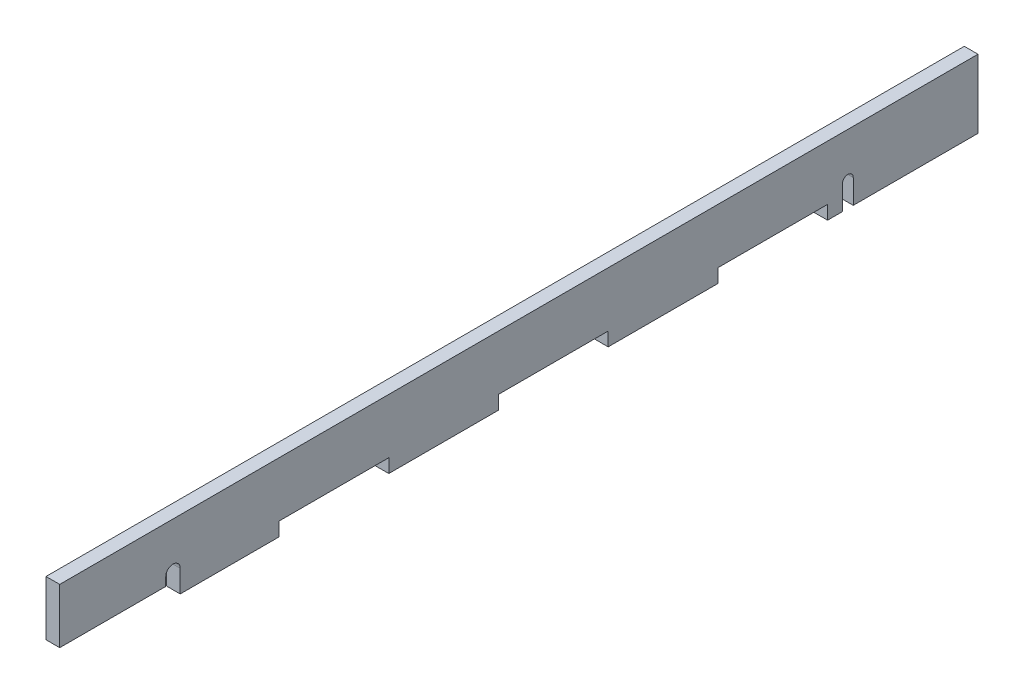
ISO-10303-21;
HEADER;
FILE_DESCRIPTION(('STEP AP214'),'2;1');
FILE_NAME('part.step','',(''),(''),'','','');
FILE_SCHEMA(('AUTOMOTIVE_DESIGN { 1 0 10303 214 1 1 1 1 }'));
ENDSEC;
DATA;
#1=APPLICATION_CONTEXT('core data for automotive mechanical design processes');
#2=APPLICATION_PROTOCOL_DEFINITION('international standard','automotive_design',2000,#1);
#3=PRODUCT_CONTEXT('',#1,'mechanical');
#4=PRODUCT('Part','Part','',(#3));
#5=PRODUCT_RELATED_PRODUCT_CATEGORY('part','',(#4));
#6=PRODUCT_DEFINITION_FORMATION('','',#4);
#7=PRODUCT_DEFINITION_CONTEXT('part definition',#1,'design');
#8=PRODUCT_DEFINITION('design','',#6,#7);
#9=PRODUCT_DEFINITION_SHAPE('','',#8);
#10=(LENGTH_UNIT() NAMED_UNIT(*) SI_UNIT(.MILLI.,.METRE.));
#11=(NAMED_UNIT(*) PLANE_ANGLE_UNIT() SI_UNIT($,.RADIAN.));
#12=(NAMED_UNIT(*) SI_UNIT($,.STERADIAN.) SOLID_ANGLE_UNIT());
#13=UNCERTAINTY_MEASURE_WITH_UNIT(LENGTH_MEASURE(1.E-05),#10,'distance_accuracy_value','');
#14=(GEOMETRIC_REPRESENTATION_CONTEXT(3) GLOBAL_UNCERTAINTY_ASSIGNED_CONTEXT((#13)) GLOBAL_UNIT_ASSIGNED_CONTEXT((#10,
#11,#12)) REPRESENTATION_CONTEXT('',''));
#15=CARTESIAN_POINT('',(0.,0.,0.));
#16=DIRECTION('',(0.,0.,1.));
#17=DIRECTION('',(1.,0.,0.));
#18=AXIS2_PLACEMENT_3D('',#15,#16,#17);
#19=CARTESIAN_POINT('',(6.35,0.,-353.119405744122));
#20=DIRECTION('',(0.,1.,0.));
#21=DIRECTION('',(0.,0.,1.));
#22=AXIS2_PLACEMENT_3D('',#19,#20,#21);
#23=PLANE('',#22);
#24=DIRECTION('',(0.,0.,-1.));
#25=VECTOR('',#24,1.);
#26=CARTESIAN_POINT('',(6.35,0.,-353.119405744122));
#27=LINE('',#26,#25);
#28=CARTESIAN_POINT('',(6.35,0.,-365.019405744122));
#29=VERTEX_POINT('',#28);
#30=CARTESIAN_POINT('',(6.35,0.,-422.789544579189));
#31=VERTEX_POINT('',#30);
#32=EDGE_CURVE('E288',#29,#31,#27,.T.);
#33=ORIENTED_EDGE('',*,*,#32,.F.);
#34=DIRECTION('',(1.,0.,0.));
#35=VECTOR('',#34,1.);
#36=CARTESIAN_POINT('',(-0.00100000000000013,0.,-365.019405744122));
#37=LINE('',#36,#35);
#38=CARTESIAN_POINT('',(0.,0.,-365.019405744122));
#39=VERTEX_POINT('',#38);
#40=EDGE_CURVE('E231',#39,#29,#37,.T.);
#41=ORIENTED_EDGE('',*,*,#40,.F.);
#42=DIRECTION('',(0.,0.,-1.));
#43=VECTOR('',#42,1.);
#44=CARTESIAN_POINT('',(0.,0.,-353.119405744122));
#45=LINE('',#44,#43);
#46=CARTESIAN_POINT('',(0.,0.,-422.789544579189));
#47=VERTEX_POINT('',#46);
#48=EDGE_CURVE('E325',#39,#47,#45,.T.);
#49=ORIENTED_EDGE('',*,*,#48,.T.);
#50=DIRECTION('',(-1.,0.,0.));
#51=VECTOR('',#50,1.);
#52=CARTESIAN_POINT('',(6.35,0.,-422.789544579189));
#53=LINE('',#52,#51);
#54=EDGE_CURVE('E292',#31,#47,#53,.T.);
#55=ORIENTED_EDGE('',*,*,#54,.F.);
#56=EDGE_LOOP('',(#33,#41,#49,#55));
#57=FACE_BOUND('',#56,.T.);
#58=ADVANCED_FACE('F35',(#57),#23,.F.);
#59=CARTESIAN_POINT('',(6.35,0.,-422.789544579189));
#60=DIRECTION('',(0.,0.,1.));
#61=DIRECTION('',(1.,0.,0.));
#62=AXIS2_PLACEMENT_3D('',#59,#60,#61);
#63=PLANE('',#62);
#64=DIRECTION('',(0.,1.,0.));
#65=VECTOR('',#64,1.);
#66=CARTESIAN_POINT('',(0.,0.,-422.789544579189));
#67=LINE('',#66,#65);
#68=CARTESIAN_POINT('',(0.,31.7499999999996,-422.789544579189));
#69=VERTEX_POINT('',#68);
#70=EDGE_CURVE('E252',#47,#69,#67,.T.);
#71=ORIENTED_EDGE('',*,*,#70,.T.);
#72=DIRECTION('',(-1.,0.,0.));
#73=VECTOR('',#72,1.);
#74=CARTESIAN_POINT('',(6.35,31.7499999999996,-422.789544579189));
#75=LINE('',#74,#73);
#76=CARTESIAN_POINT('',(6.35,31.7499999999996,-422.789544579189));
#77=VERTEX_POINT('',#76);
#78=EDGE_CURVE('E11',#77,#69,#75,.T.);
#79=ORIENTED_EDGE('',*,*,#78,.F.);
#80=DIRECTION('',(0.,1.,0.));
#81=VECTOR('',#80,1.);
#82=CARTESIAN_POINT('',(6.35,0.,-422.789544579189));
#83=LINE('',#82,#81);
#84=EDGE_CURVE('E253',#31,#77,#83,.T.);
#85=ORIENTED_EDGE('',*,*,#84,.F.);
#86=ORIENTED_EDGE('',*,*,#54,.T.);
#87=EDGE_LOOP('',(#71,#79,#85,#86));
#88=FACE_BOUND('',#87,.T.);
#89=ADVANCED_FACE('F37',(#88),#63,.F.);
#90=CARTESIAN_POINT('',(6.35,31.7499999999996,2.48059425587843));
#91=DIRECTION('',(0.,-1.,0.));
#92=DIRECTION('',(0.,0.,-1.));
#93=AXIS2_PLACEMENT_3D('',#90,#91,#92);
#94=PLANE('',#93);
#95=DIRECTION('',(0.,0.,1.));
#96=VECTOR('',#95,1.);
#97=CARTESIAN_POINT('',(0.,31.7499999999996,2.48059425587843));
#98=LINE('',#97,#96);
#99=CARTESIAN_POINT('',(0.,31.7499999999996,2.48059425587843));
#100=VERTEX_POINT('',#99);
#101=EDGE_CURVE('E295',#69,#100,#98,.T.);
#102=ORIENTED_EDGE('',*,*,#101,.T.);
#103=DIRECTION('',(-1.,0.,0.));
#104=VECTOR('',#103,1.);
#105=CARTESIAN_POINT('',(6.35,31.7499999999996,2.48059425587843));
#106=LINE('',#105,#104);
#107=CARTESIAN_POINT('',(6.35,31.7499999999996,2.48059425587843));
#108=VERTEX_POINT('',#107);
#109=EDGE_CURVE('E43',#108,#100,#106,.T.);
#110=ORIENTED_EDGE('',*,*,#109,.F.);
#111=DIRECTION('',(0.,0.,1.));
#112=VECTOR('',#111,1.);
#113=CARTESIAN_POINT('',(6.35,31.7499999999996,2.48059425587843));
#114=LINE('',#113,#112);
#115=EDGE_CURVE('E256',#77,#108,#114,.T.);
#116=ORIENTED_EDGE('',*,*,#115,.F.);
#117=ORIENTED_EDGE('',*,*,#78,.T.);
#118=EDGE_LOOP('',(#102,#110,#116,#117));
#119=FACE_BOUND('',#118,.T.);
#120=ADVANCED_FACE('F384',(#119),#94,.F.);
#121=CARTESIAN_POINT('',(6.35,6.34999999999997,2.48059425587843));
#122=DIRECTION('',(0.,0.,-1.));
#123=DIRECTION('',(-1.,0.,0.));
#124=AXIS2_PLACEMENT_3D('',#121,#122,#123);
#125=PLANE('',#124);
#126=DIRECTION('',(0.,-1.,0.));
#127=VECTOR('',#126,1.);
#128=CARTESIAN_POINT('',(0.,6.34999999999997,2.48059425587843));
#129=LINE('',#128,#127);
#130=CARTESIAN_POINT('',(0.,6.34999999999997,2.48059425587843));
#131=VERTEX_POINT('',#130);
#132=EDGE_CURVE('E297',#100,#131,#129,.T.);
#133=ORIENTED_EDGE('',*,*,#132,.T.);
#134=DIRECTION('',(-1.,0.,0.));
#135=VECTOR('',#134,1.);
#136=CARTESIAN_POINT('',(6.35,6.34999999999997,2.48059425587843));
#137=LINE('',#136,#135);
#138=CARTESIAN_POINT('',(6.35,6.34999999999997,2.48059425587843));
#139=VERTEX_POINT('',#138);
#140=EDGE_CURVE('E366',#139,#131,#137,.T.);
#141=ORIENTED_EDGE('',*,*,#140,.F.);
#142=DIRECTION('',(0.,-1.,0.));
#143=VECTOR('',#142,1.);
#144=CARTESIAN_POINT('',(6.35,6.34999999999997,2.48059425587843));
#145=LINE('',#144,#143);
#146=EDGE_CURVE('E259',#108,#139,#145,.T.);
#147=ORIENTED_EDGE('',*,*,#146,.F.);
#148=ORIENTED_EDGE('',*,*,#109,.T.);
#149=EDGE_LOOP('',(#133,#141,#147,#148));
#150=FACE_BOUND('',#149,.T.);
#151=ADVANCED_FACE('F373',(#150),#125,.F.);
#152=CARTESIAN_POINT('',(6.35,6.34999999999997,2.48059425587843));
#153=DIRECTION('',(0.,1.,0.));
#154=DIRECTION('',(0.,0.,1.));
#155=AXIS2_PLACEMENT_3D('',#152,#153,#154);
#156=PLANE('',#155);
#157=DIRECTION('',(0.,0.,-1.));
#158=VECTOR('',#157,1.);
#159=CARTESIAN_POINT('',(0.,6.34999999999997,2.48059425587843));
#160=LINE('',#159,#158);
#161=CARTESIAN_POINT('',(0.,6.34999999999999,-46.6194057441216));
#162=VERTEX_POINT('',#161);
#163=EDGE_CURVE('E299',#131,#162,#160,.T.);
#164=ORIENTED_EDGE('',*,*,#163,.T.);
#165=DIRECTION('',(1.,0.,0.));
#166=VECTOR('',#165,1.);
#167=CARTESIAN_POINT('',(0.,6.34999999999997,-46.6194057441216));
#168=LINE('',#167,#166);
#169=CARTESIAN_POINT('',(6.35,6.34999999999997,-46.6194057441216));
#170=VERTEX_POINT('',#169);
#171=EDGE_CURVE('E50',#162,#170,#168,.T.);
#172=ORIENTED_EDGE('',*,*,#171,.T.);
#173=DIRECTION('',(0.,0.,-1.));
#174=VECTOR('',#173,1.);
#175=CARTESIAN_POINT('',(6.35,6.34999999999997,2.48059425587843));
#176=LINE('',#175,#174);
#177=EDGE_CURVE('E261',#139,#170,#176,.T.);
#178=ORIENTED_EDGE('',*,*,#177,.F.);
#179=ORIENTED_EDGE('',*,*,#140,.T.);
#180=EDGE_LOOP('',(#164,#172,#178,#179));
#181=FACE_BOUND('',#180,.T.);
#182=ADVANCED_FACE('F378',(#181),#156,.F.);
#183=CARTESIAN_POINT('',(6.35,0.,-48.3194057441216));
#184=DIRECTION('',(0.,1.,0.));
#185=DIRECTION('',(0.,0.,1.));
#186=AXIS2_PLACEMENT_3D('',#183,#184,#185);
#187=PLANE('',#186);
#188=DIRECTION('',(0.,0.,-1.));
#189=VECTOR('',#188,1.);
#190=CARTESIAN_POINT('',(6.35,0.,-48.3194057441216));
#191=LINE('',#190,#189);
#192=CARTESIAN_POINT('',(6.35,0.,-53.3194057441216));
#193=VERTEX_POINT('',#192);
#194=CARTESIAN_POINT('',(6.35,0.,-99.1194057441216));
#195=VERTEX_POINT('',#194);
#196=EDGE_CURVE('E264',#193,#195,#191,.T.);
#197=ORIENTED_EDGE('',*,*,#196,.F.);
#198=DIRECTION('',(1.,0.,0.));
#199=VECTOR('',#198,1.);
#200=CARTESIAN_POINT('',(0.,0.,-53.3194057441216));
#201=LINE('',#200,#199);
#202=CARTESIAN_POINT('',(0.,0.,-53.3194057441216));
#203=VERTEX_POINT('',#202);
#204=EDGE_CURVE('E227',#203,#193,#201,.T.);
#205=ORIENTED_EDGE('',*,*,#204,.F.);
#206=DIRECTION('',(0.,0.,-1.));
#207=VECTOR('',#206,1.);
#208=CARTESIAN_POINT('',(0.,0.,-48.3194057441216));
#209=LINE('',#208,#207);
#210=CARTESIAN_POINT('',(0.,0.,-99.1194057441216));
#211=VERTEX_POINT('',#210);
#212=EDGE_CURVE('E301',#203,#211,#209,.T.);
#213=ORIENTED_EDGE('',*,*,#212,.T.);
#214=DIRECTION('',(-1.,0.,0.));
#215=VECTOR('',#214,1.);
#216=CARTESIAN_POINT('',(6.35,0.,-99.1194057441216));
#217=LINE('',#216,#215);
#218=EDGE_CURVE('E363',#195,#211,#217,.T.);
#219=ORIENTED_EDGE('',*,*,#218,.F.);
#220=EDGE_LOOP('',(#197,#205,#213,#219));
#221=FACE_BOUND('',#220,.T.);
#222=ADVANCED_FACE('F462',(#221),#187,.F.);
#223=CARTESIAN_POINT('',(6.35,6.34999999999997,-99.1194057441216));
#224=DIRECTION('',(0.,0.,1.));
#225=DIRECTION('',(1.,0.,0.));
#226=AXIS2_PLACEMENT_3D('',#223,#224,#225);
#227=PLANE('',#226);
#228=DIRECTION('',(0.,1.,0.));
#229=VECTOR('',#228,1.);
#230=CARTESIAN_POINT('',(0.,6.34999999999997,-99.1194057441216));
#231=LINE('',#230,#229);
#232=CARTESIAN_POINT('',(0.,6.34999999999997,-99.1194057441216));
#233=VERTEX_POINT('',#232);
#234=EDGE_CURVE('E303',#211,#233,#231,.T.);
#235=ORIENTED_EDGE('',*,*,#234,.T.);
#236=DIRECTION('',(-1.,0.,0.));
#237=VECTOR('',#236,1.);
#238=CARTESIAN_POINT('',(6.35,6.34999999999997,-99.1194057441216));
#239=LINE('',#238,#237);
#240=CARTESIAN_POINT('',(6.35,6.34999999999997,-99.1194057441216));
#241=VERTEX_POINT('',#240);
#242=EDGE_CURVE('E360',#241,#233,#239,.T.);
#243=ORIENTED_EDGE('',*,*,#242,.F.);
#244=DIRECTION('',(0.,1.,0.));
#245=VECTOR('',#244,1.);
#246=CARTESIAN_POINT('',(6.35,6.34999999999997,-99.1194057441216));
#247=LINE('',#246,#245);
#248=EDGE_CURVE('E266',#195,#241,#247,.T.);
#249=ORIENTED_EDGE('',*,*,#248,.F.);
#250=ORIENTED_EDGE('',*,*,#218,.T.);
#251=EDGE_LOOP('',(#235,#243,#249,#250));
#252=FACE_BOUND('',#251,.T.);
#253=ADVANCED_FACE('F457',(#252),#227,.F.);
#254=CARTESIAN_POINT('',(6.35,6.34999999999997,-99.1194057441216));
#255=DIRECTION('',(0.,1.,0.));
#256=DIRECTION('',(0.,0.,1.));
#257=AXIS2_PLACEMENT_3D('',#254,#255,#256);
#258=PLANE('',#257);
#259=DIRECTION('',(0.,0.,-1.));
#260=VECTOR('',#259,1.);
#261=CARTESIAN_POINT('',(0.,6.34999999999997,-99.1194057441216));
#262=LINE('',#261,#260);
#263=CARTESIAN_POINT('',(0.,6.34999999999997,-149.919405744122));
#264=VERTEX_POINT('',#263);
#265=EDGE_CURVE('E305',#233,#264,#262,.T.);
#266=ORIENTED_EDGE('',*,*,#265,.T.);
#267=DIRECTION('',(-1.,0.,0.));
#268=VECTOR('',#267,1.);
#269=CARTESIAN_POINT('',(6.35,6.34999999999997,-149.919405744122));
#270=LINE('',#269,#268);
#271=CARTESIAN_POINT('',(6.35,6.34999999999997,-149.919405744122));
#272=VERTEX_POINT('',#271);
#273=EDGE_CURVE('E357',#272,#264,#270,.T.);
#274=ORIENTED_EDGE('',*,*,#273,.F.);
#275=DIRECTION('',(0.,0.,-1.));
#276=VECTOR('',#275,1.);
#277=CARTESIAN_POINT('',(6.35,6.34999999999997,-99.1194057441216));
#278=LINE('',#277,#276);
#279=EDGE_CURVE('E268',#241,#272,#278,.T.);
#280=ORIENTED_EDGE('',*,*,#279,.F.);
#281=ORIENTED_EDGE('',*,*,#242,.T.);
#282=EDGE_LOOP('',(#266,#274,#280,#281));
#283=FACE_BOUND('',#282,.T.);
#284=ADVANCED_FACE('F453',(#283),#258,.F.);
#285=CARTESIAN_POINT('',(6.35,6.34999999999997,-149.919405744122));
#286=DIRECTION('',(0.,0.,-1.));
#287=DIRECTION('',(-1.,0.,0.));
#288=AXIS2_PLACEMENT_3D('',#285,#286,#287);
#289=PLANE('',#288);
#290=DIRECTION('',(0.,-1.,0.));
#291=VECTOR('',#290,1.);
#292=CARTESIAN_POINT('',(0.,6.34999999999997,-149.919405744122));
#293=LINE('',#292,#291);
#294=CARTESIAN_POINT('',(0.,0.,-149.919405744122));
#295=VERTEX_POINT('',#294);
#296=EDGE_CURVE('E307',#264,#295,#293,.T.);
#297=ORIENTED_EDGE('',*,*,#296,.T.);
#298=DIRECTION('',(-1.,0.,0.));
#299=VECTOR('',#298,1.);
#300=CARTESIAN_POINT('',(6.35,0.,-149.919405744122));
#301=LINE('',#300,#299);
#302=CARTESIAN_POINT('',(6.35,0.,-149.919405744122));
#303=VERTEX_POINT('',#302);
#304=EDGE_CURVE('E354',#303,#295,#301,.T.);
#305=ORIENTED_EDGE('',*,*,#304,.F.);
#306=DIRECTION('',(0.,-1.,0.));
#307=VECTOR('',#306,1.);
#308=CARTESIAN_POINT('',(6.35,6.34999999999997,-149.919405744122));
#309=LINE('',#308,#307);
#310=EDGE_CURVE('E270',#272,#303,#309,.T.);
#311=ORIENTED_EDGE('',*,*,#310,.F.);
#312=ORIENTED_EDGE('',*,*,#273,.T.);
#313=EDGE_LOOP('',(#297,#305,#311,#312));
#314=FACE_BOUND('',#313,.T.);
#315=ADVANCED_FACE('F449',(#314),#289,.F.);
#316=CARTESIAN_POINT('',(6.35,0.,-149.919405744122));
#317=DIRECTION('',(0.,1.,0.));
#318=DIRECTION('',(0.,0.,1.));
#319=AXIS2_PLACEMENT_3D('',#316,#317,#318);
#320=PLANE('',#319);
#321=DIRECTION('',(0.,0.,-1.));
#322=VECTOR('',#321,1.);
#323=CARTESIAN_POINT('',(0.,0.,-149.919405744122));
#324=LINE('',#323,#322);
#325=CARTESIAN_POINT('',(0.,0.,-200.719405744122));
#326=VERTEX_POINT('',#325);
#327=EDGE_CURVE('E309',#295,#326,#324,.T.);
#328=ORIENTED_EDGE('',*,*,#327,.T.);
#329=DIRECTION('',(-1.,0.,0.));
#330=VECTOR('',#329,1.);
#331=CARTESIAN_POINT('',(6.35,0.,-200.719405744122));
#332=LINE('',#331,#330);
#333=CARTESIAN_POINT('',(6.35,0.,-200.719405744122));
#334=VERTEX_POINT('',#333);
#335=EDGE_CURVE('E351',#334,#326,#332,.T.);
#336=ORIENTED_EDGE('',*,*,#335,.F.);
#337=DIRECTION('',(0.,0.,-1.));
#338=VECTOR('',#337,1.);
#339=CARTESIAN_POINT('',(6.35,0.,-149.919405744122));
#340=LINE('',#339,#338);
#341=EDGE_CURVE('E272',#303,#334,#340,.T.);
#342=ORIENTED_EDGE('',*,*,#341,.F.);
#343=ORIENTED_EDGE('',*,*,#304,.T.);
#344=EDGE_LOOP('',(#328,#336,#342,#343));
#345=FACE_BOUND('',#344,.T.);
#346=ADVANCED_FACE('F444',(#345),#320,.F.);
#347=CARTESIAN_POINT('',(6.35,6.34999999999997,-200.719405744122));
#348=DIRECTION('',(0.,0.,1.));
#349=DIRECTION('',(1.,0.,0.));
#350=AXIS2_PLACEMENT_3D('',#347,#348,#349);
#351=PLANE('',#350);
#352=DIRECTION('',(0.,1.,0.));
#353=VECTOR('',#352,1.);
#354=CARTESIAN_POINT('',(0.,6.34999999999997,-200.719405744122));
#355=LINE('',#354,#353);
#356=CARTESIAN_POINT('',(0.,6.34999999999997,-200.719405744122));
#357=VERTEX_POINT('',#356);
#358=EDGE_CURVE('E311',#326,#357,#355,.T.);
#359=ORIENTED_EDGE('',*,*,#358,.T.);
#360=DIRECTION('',(-1.,0.,0.));
#361=VECTOR('',#360,1.);
#362=CARTESIAN_POINT('',(6.35,6.34999999999997,-200.719405744122));
#363=LINE('',#362,#361);
#364=CARTESIAN_POINT('',(6.35,6.34999999999997,-200.719405744122));
#365=VERTEX_POINT('',#364);
#366=EDGE_CURVE('E348',#365,#357,#363,.T.);
#367=ORIENTED_EDGE('',*,*,#366,.F.);
#368=DIRECTION('',(0.,1.,0.));
#369=VECTOR('',#368,1.);
#370=CARTESIAN_POINT('',(6.35,6.34999999999997,-200.719405744122));
#371=LINE('',#370,#369);
#372=EDGE_CURVE('E274',#334,#365,#371,.T.);
#373=ORIENTED_EDGE('',*,*,#372,.F.);
#374=ORIENTED_EDGE('',*,*,#335,.T.);
#375=EDGE_LOOP('',(#359,#367,#373,#374));
#376=FACE_BOUND('',#375,.T.);
#377=ADVANCED_FACE('F438',(#376),#351,.F.);
#378=CARTESIAN_POINT('',(6.35,6.34999999999997,-200.719405744122));
#379=DIRECTION('',(0.,1.,0.));
#380=DIRECTION('',(0.,0.,1.));
#381=AXIS2_PLACEMENT_3D('',#378,#379,#380);
#382=PLANE('',#381);
#383=DIRECTION('',(0.,0.,-1.));
#384=VECTOR('',#383,1.);
#385=CARTESIAN_POINT('',(0.,6.34999999999997,-200.719405744122));
#386=LINE('',#385,#384);
#387=CARTESIAN_POINT('',(0.,6.34999999999997,-251.519405744122));
#388=VERTEX_POINT('',#387);
#389=EDGE_CURVE('E313',#357,#388,#386,.T.);
#390=ORIENTED_EDGE('',*,*,#389,.T.);
#391=DIRECTION('',(-1.,0.,0.));
#392=VECTOR('',#391,1.);
#393=CARTESIAN_POINT('',(6.35,6.34999999999997,-251.519405744122));
#394=LINE('',#393,#392);
#395=CARTESIAN_POINT('',(6.35,6.34999999999997,-251.519405744122));
#396=VERTEX_POINT('',#395);
#397=EDGE_CURVE('E345',#396,#388,#394,.T.);
#398=ORIENTED_EDGE('',*,*,#397,.F.);
#399=DIRECTION('',(0.,0.,-1.));
#400=VECTOR('',#399,1.);
#401=CARTESIAN_POINT('',(6.35,6.34999999999997,-200.719405744122));
#402=LINE('',#401,#400);
#403=EDGE_CURVE('E276',#365,#396,#402,.T.);
#404=ORIENTED_EDGE('',*,*,#403,.F.);
#405=ORIENTED_EDGE('',*,*,#366,.T.);
#406=EDGE_LOOP('',(#390,#398,#404,#405));
#407=FACE_BOUND('',#406,.T.);
#408=ADVANCED_FACE('F434',(#407),#382,.F.);
#409=CARTESIAN_POINT('',(6.35,6.34999999999997,-251.519405744122));
#410=DIRECTION('',(0.,0.,-1.));
#411=DIRECTION('',(-1.,0.,0.));
#412=AXIS2_PLACEMENT_3D('',#409,#410,#411);
#413=PLANE('',#412);
#414=DIRECTION('',(0.,-1.,0.));
#415=VECTOR('',#414,1.);
#416=CARTESIAN_POINT('',(0.,6.34999999999997,-251.519405744122));
#417=LINE('',#416,#415);
#418=CARTESIAN_POINT('',(0.,0.,-251.519405744122));
#419=VERTEX_POINT('',#418);
#420=EDGE_CURVE('E315',#388,#419,#417,.T.);
#421=ORIENTED_EDGE('',*,*,#420,.T.);
#422=DIRECTION('',(-1.,0.,0.));
#423=VECTOR('',#422,1.);
#424=CARTESIAN_POINT('',(6.35,0.,-251.519405744122));
#425=LINE('',#424,#423);
#426=CARTESIAN_POINT('',(6.35,0.,-251.519405744122));
#427=VERTEX_POINT('',#426);
#428=EDGE_CURVE('E342',#427,#419,#425,.T.);
#429=ORIENTED_EDGE('',*,*,#428,.F.);
#430=DIRECTION('',(0.,-1.,0.));
#431=VECTOR('',#430,1.);
#432=CARTESIAN_POINT('',(6.35,6.34999999999997,-251.519405744122));
#433=LINE('',#432,#431);
#434=EDGE_CURVE('E278',#396,#427,#433,.T.);
#435=ORIENTED_EDGE('',*,*,#434,.F.);
#436=ORIENTED_EDGE('',*,*,#397,.T.);
#437=EDGE_LOOP('',(#421,#429,#435,#436));
#438=FACE_BOUND('',#437,.T.);
#439=ADVANCED_FACE('F429',(#438),#413,.F.);
#440=CARTESIAN_POINT('',(6.35,0.,-251.519405744122));
#441=DIRECTION('',(0.,1.,0.));
#442=DIRECTION('',(0.,0.,1.));
#443=AXIS2_PLACEMENT_3D('',#440,#441,#442);
#444=PLANE('',#443);
#445=DIRECTION('',(0.,0.,-1.));
#446=VECTOR('',#445,1.);
#447=CARTESIAN_POINT('',(0.,0.,-251.519405744122));
#448=LINE('',#447,#446);
#449=CARTESIAN_POINT('',(0.,0.,-302.319405744122));
#450=VERTEX_POINT('',#449);
#451=EDGE_CURVE('E317',#419,#450,#448,.T.);
#452=ORIENTED_EDGE('',*,*,#451,.T.);
#453=DIRECTION('',(-1.,0.,0.));
#454=VECTOR('',#453,1.);
#455=CARTESIAN_POINT('',(6.35,0.,-302.319405744122));
#456=LINE('',#455,#454);
#457=CARTESIAN_POINT('',(6.35,0.,-302.319405744122));
#458=VERTEX_POINT('',#457);
#459=EDGE_CURVE('E339',#458,#450,#456,.T.);
#460=ORIENTED_EDGE('',*,*,#459,.F.);
#461=DIRECTION('',(0.,0.,-1.));
#462=VECTOR('',#461,1.);
#463=CARTESIAN_POINT('',(6.35,0.,-251.519405744122));
#464=LINE('',#463,#462);
#465=EDGE_CURVE('E280',#427,#458,#464,.T.);
#466=ORIENTED_EDGE('',*,*,#465,.F.);
#467=ORIENTED_EDGE('',*,*,#428,.T.);
#468=EDGE_LOOP('',(#452,#460,#466,#467));
#469=FACE_BOUND('',#468,.T.);
#470=ADVANCED_FACE('F423',(#469),#444,.F.);
#471=CARTESIAN_POINT('',(6.35,6.34999999999997,-302.319405744122));
#472=DIRECTION('',(0.,0.,1.));
#473=DIRECTION('',(1.,0.,0.));
#474=AXIS2_PLACEMENT_3D('',#471,#472,#473);
#475=PLANE('',#474);
#476=DIRECTION('',(0.,1.,0.));
#477=VECTOR('',#476,1.);
#478=CARTESIAN_POINT('',(0.,6.34999999999997,-302.319405744122));
#479=LINE('',#478,#477);
#480=CARTESIAN_POINT('',(0.,6.34999999999997,-302.319405744122));
#481=VERTEX_POINT('',#480);
#482=EDGE_CURVE('E319',#450,#481,#479,.T.);
#483=ORIENTED_EDGE('',*,*,#482,.T.);
#484=DIRECTION('',(-1.,0.,0.));
#485=VECTOR('',#484,1.);
#486=CARTESIAN_POINT('',(6.35,6.34999999999997,-302.319405744122));
#487=LINE('',#486,#485);
#488=CARTESIAN_POINT('',(6.35,6.34999999999997,-302.319405744122));
#489=VERTEX_POINT('',#488);
#490=EDGE_CURVE('E336',#489,#481,#487,.T.);
#491=ORIENTED_EDGE('',*,*,#490,.F.);
#492=DIRECTION('',(0.,1.,0.));
#493=VECTOR('',#492,1.);
#494=CARTESIAN_POINT('',(6.35,6.34999999999997,-302.319405744122));
#495=LINE('',#494,#493);
#496=EDGE_CURVE('E282',#458,#489,#495,.T.);
#497=ORIENTED_EDGE('',*,*,#496,.F.);
#498=ORIENTED_EDGE('',*,*,#459,.T.);
#499=EDGE_LOOP('',(#483,#491,#497,#498));
#500=FACE_BOUND('',#499,.T.);
#501=ADVANCED_FACE('F419',(#500),#475,.F.);
#502=CARTESIAN_POINT('',(6.35,6.34999999999997,-302.319405744122));
#503=DIRECTION('',(0.,1.,0.));
#504=DIRECTION('',(0.,0.,1.));
#505=AXIS2_PLACEMENT_3D('',#502,#503,#504);
#506=PLANE('',#505);
#507=DIRECTION('',(0.,0.,-1.));
#508=VECTOR('',#507,1.);
#509=CARTESIAN_POINT('',(0.,6.34999999999997,-302.319405744122));
#510=LINE('',#509,#508);
#511=CARTESIAN_POINT('',(0.,6.34999999999997,-353.119405744122));
#512=VERTEX_POINT('',#511);
#513=EDGE_CURVE('E321',#481,#512,#510,.T.);
#514=ORIENTED_EDGE('',*,*,#513,.T.);
#515=DIRECTION('',(-1.,0.,0.));
#516=VECTOR('',#515,1.);
#517=CARTESIAN_POINT('',(6.35,6.34999999999997,-353.119405744122));
#518=LINE('',#517,#516);
#519=CARTESIAN_POINT('',(6.35,6.34999999999997,-353.119405744122));
#520=VERTEX_POINT('',#519);
#521=EDGE_CURVE('E333',#520,#512,#518,.T.);
#522=ORIENTED_EDGE('',*,*,#521,.F.);
#523=DIRECTION('',(0.,0.,-1.));
#524=VECTOR('',#523,1.);
#525=CARTESIAN_POINT('',(6.35,6.34999999999997,-302.319405744122));
#526=LINE('',#525,#524);
#527=EDGE_CURVE('E284',#489,#520,#526,.T.);
#528=ORIENTED_EDGE('',*,*,#527,.F.);
#529=ORIENTED_EDGE('',*,*,#490,.T.);
#530=EDGE_LOOP('',(#514,#522,#528,#529));
#531=FACE_BOUND('',#530,.T.);
#532=ADVANCED_FACE('F414',(#531),#506,.F.);
#533=CARTESIAN_POINT('',(6.35,6.34999999999997,-353.119405744122));
#534=DIRECTION('',(0.,0.,-1.));
#535=DIRECTION('',(-1.,0.,0.));
#536=AXIS2_PLACEMENT_3D('',#533,#534,#535);
#537=PLANE('',#536);
#538=DIRECTION('',(0.,-1.,0.));
#539=VECTOR('',#538,1.);
#540=CARTESIAN_POINT('',(0.,6.34999999999997,-353.119405744122));
#541=LINE('',#540,#539);
#542=CARTESIAN_POINT('',(0.,0.,-353.119405744122));
#543=VERTEX_POINT('',#542);
#544=EDGE_CURVE('E323',#512,#543,#541,.T.);
#545=ORIENTED_EDGE('',*,*,#544,.T.);
#546=DIRECTION('',(-1.,0.,0.));
#547=VECTOR('',#546,1.);
#548=CARTESIAN_POINT('',(6.35,0.,-353.119405744122));
#549=LINE('',#548,#547);
#550=CARTESIAN_POINT('',(6.35,0.,-353.119405744122));
#551=VERTEX_POINT('',#550);
#552=EDGE_CURVE('E330',#551,#543,#549,.T.);
#553=ORIENTED_EDGE('',*,*,#552,.F.);
#554=DIRECTION('',(0.,-1.,0.));
#555=VECTOR('',#554,1.);
#556=CARTESIAN_POINT('',(6.35,6.34999999999997,-353.119405744122));
#557=LINE('',#556,#555);
#558=EDGE_CURVE('E286',#520,#551,#557,.T.);
#559=ORIENTED_EDGE('',*,*,#558,.F.);
#560=ORIENTED_EDGE('',*,*,#521,.T.);
#561=EDGE_LOOP('',(#545,#553,#559,#560));
#562=FACE_BOUND('',#561,.T.);
#563=ADVANCED_FACE('F408',(#562),#537,.F.);
#564=CARTESIAN_POINT('',(0.,0.,-360.019405744122));
#565=VERTEX_POINT('',#564);
#566=EDGE_CURVE('E257',#543,#565,#45,.T.);
#567=ORIENTED_EDGE('',*,*,#566,.T.);
#568=DIRECTION('',(-1.,0.,0.));
#569=VECTOR('',#568,1.);
#570=CARTESIAN_POINT('',(-0.00100000000000013,0.,-360.019405744122));
#571=LINE('',#570,#569);
#572=CARTESIAN_POINT('',(6.35,0.,-360.019405744122));
#573=VERTEX_POINT('',#572);
#574=EDGE_CURVE('E226',#573,#565,#571,.T.);
#575=ORIENTED_EDGE('',*,*,#574,.F.);
#576=EDGE_CURVE('E289',#551,#573,#27,.T.);
#577=ORIENTED_EDGE('',*,*,#576,.F.);
#578=ORIENTED_EDGE('',*,*,#552,.T.);
#579=EDGE_LOOP('',(#567,#575,#577,#578));
#580=FACE_BOUND('',#579,.T.);
#581=ADVANCED_FACE('F403',(#580),#23,.F.);
#582=CARTESIAN_POINT('',(6.35,0.,0.));
#583=DIRECTION('',(-1.,0.,0.));
#584=DIRECTION('',(0.,0.,1.));
#585=AXIS2_PLACEMENT_3D('',#582,#583,#584);
#586=PLANE('',#585);
#587=CARTESIAN_POINT('',(6.35,10.31,-49.9694057441216));
#588=DIRECTION('',(1.,0.,0.));
#589=DIRECTION('',(0.,0.,-1.));
#590=AXIS2_PLACEMENT_3D('',#587,#588,#589);
#591=CIRCLE('',#590,3.35000000000001);
#592=CARTESIAN_POINT('',(6.35,10.31,-53.3194057441216));
#593=VERTEX_POINT('',#592);
#594=CARTESIAN_POINT('',(6.35,10.31,-46.6194057441216));
#595=VERTEX_POINT('',#594);
#596=EDGE_CURVE('E203',#593,#595,#591,.T.);
#597=ORIENTED_EDGE('',*,*,#596,.F.);
#598=DIRECTION('',(0.,1.,0.));
#599=VECTOR('',#598,1.);
#600=CARTESIAN_POINT('',(6.35,10.31,-53.3194057441216));
#601=LINE('',#600,#599);
#602=EDGE_CURVE('E215',#193,#593,#601,.T.);
#603=ORIENTED_EDGE('',*,*,#602,.F.);
#604=ORIENTED_EDGE('',*,*,#196,.T.);
#605=ORIENTED_EDGE('',*,*,#248,.T.);
#606=ORIENTED_EDGE('',*,*,#279,.T.);
#607=ORIENTED_EDGE('',*,*,#310,.T.);
#608=ORIENTED_EDGE('',*,*,#341,.T.);
#609=ORIENTED_EDGE('',*,*,#372,.T.);
#610=ORIENTED_EDGE('',*,*,#403,.T.);
#611=ORIENTED_EDGE('',*,*,#434,.T.);
#612=ORIENTED_EDGE('',*,*,#465,.T.);
#613=ORIENTED_EDGE('',*,*,#496,.T.);
#614=ORIENTED_EDGE('',*,*,#527,.T.);
#615=ORIENTED_EDGE('',*,*,#558,.T.);
#616=ORIENTED_EDGE('',*,*,#576,.T.);
#617=DIRECTION('',(0.,-1.,0.));
#618=VECTOR('',#617,1.);
#619=CARTESIAN_POINT('',(6.35,11.16,-360.019405744122));
#620=LINE('',#619,#618);
#621=CARTESIAN_POINT('',(6.35,11.16,-360.019405744122));
#622=VERTEX_POINT('',#621);
#623=EDGE_CURVE('E242',#622,#573,#620,.T.);
#624=ORIENTED_EDGE('',*,*,#623,.F.);
#625=CARTESIAN_POINT('',(6.35,11.16,-362.519405744122));
#626=DIRECTION('',(1.,0.,0.));
#627=DIRECTION('',(0.,0.,-1.));
#628=AXIS2_PLACEMENT_3D('',#625,#626,#627);
#629=CIRCLE('',#628,2.5);
#630=CARTESIAN_POINT('',(6.35,11.16,-365.019405744122));
#631=VERTEX_POINT('',#630);
#632=EDGE_CURVE('E239',#631,#622,#629,.T.);
#633=ORIENTED_EDGE('',*,*,#632,.F.);
#634=DIRECTION('',(0.,1.,0.));
#635=VECTOR('',#634,1.);
#636=CARTESIAN_POINT('',(6.35,11.16,-365.019405744122));
#637=LINE('',#636,#635);
#638=EDGE_CURVE('E244',#29,#631,#637,.T.);
#639=ORIENTED_EDGE('',*,*,#638,.F.);
#640=ORIENTED_EDGE('',*,*,#32,.T.);
#641=ORIENTED_EDGE('',*,*,#84,.T.);
#642=ORIENTED_EDGE('',*,*,#115,.T.);
#643=ORIENTED_EDGE('',*,*,#146,.T.);
#644=ORIENTED_EDGE('',*,*,#177,.T.);
#645=DIRECTION('',(0.,-1.,0.));
#646=VECTOR('',#645,1.);
#647=CARTESIAN_POINT('',(6.35,10.31,-46.6194057441216));
#648=LINE('',#647,#646);
#649=EDGE_CURVE('E218',#595,#170,#648,.T.);
#650=ORIENTED_EDGE('',*,*,#649,.F.);
#651=EDGE_LOOP('',(#597,#603,#604,#605,#606,#607,#608,#609,#610,#611,#612,#613,#614,#615,#616,
#624,#633,#639,#640,#641,#642,#643,#644,#650));
#652=FACE_BOUND('',#651,.T.);
#653=ADVANCED_FACE('F381',(#652),#586,.F.);
#654=CARTESIAN_POINT('',(0.,0.,0.));
#655=DIRECTION('',(-1.,0.,0.));
#656=DIRECTION('',(0.,0.,1.));
#657=AXIS2_PLACEMENT_3D('',#654,#655,#656);
#658=PLANE('',#657);
#659=DIRECTION('',(0.,1.,0.));
#660=VECTOR('',#659,1.);
#661=CARTESIAN_POINT('',(0.,10.31,-53.3194057441216));
#662=LINE('',#661,#660);
#663=CARTESIAN_POINT('',(0.,10.31,-53.3194057441216));
#664=VERTEX_POINT('',#663);
#665=EDGE_CURVE('E205',#203,#664,#662,.T.);
#666=ORIENTED_EDGE('',*,*,#665,.T.);
#667=CARTESIAN_POINT('',(0.,10.31,-49.9694057441216));
#668=DIRECTION('',(1.,0.,0.));
#669=DIRECTION('',(0.,0.,-1.));
#670=AXIS2_PLACEMENT_3D('',#667,#668,#669);
#671=CIRCLE('',#670,3.35000000000001);
#672=CARTESIAN_POINT('',(0.,10.31,-46.6194057441216));
#673=VERTEX_POINT('',#672);
#674=EDGE_CURVE('E200',#664,#673,#671,.T.);
#675=ORIENTED_EDGE('',*,*,#674,.T.);
#676=DIRECTION('',(0.,-1.,0.));
#677=VECTOR('',#676,1.);
#678=CARTESIAN_POINT('',(0.,10.31,-46.6194057441216));
#679=LINE('',#678,#677);
#680=EDGE_CURVE('E207',#673,#162,#679,.T.);
#681=ORIENTED_EDGE('',*,*,#680,.T.);
#682=ORIENTED_EDGE('',*,*,#163,.F.);
#683=ORIENTED_EDGE('',*,*,#132,.F.);
#684=ORIENTED_EDGE('',*,*,#101,.F.);
#685=ORIENTED_EDGE('',*,*,#70,.F.);
#686=ORIENTED_EDGE('',*,*,#48,.F.);
#687=DIRECTION('',(0.,1.,0.));
#688=VECTOR('',#687,1.);
#689=CARTESIAN_POINT('',(0.,11.16,-365.019405744122));
#690=LINE('',#689,#688);
#691=CARTESIAN_POINT('',(0.,11.16,-365.019405744122));
#692=VERTEX_POINT('',#691);
#693=EDGE_CURVE('E236',#39,#692,#690,.T.);
#694=ORIENTED_EDGE('',*,*,#693,.T.);
#695=CARTESIAN_POINT('',(0.,11.16,-362.519405744122));
#696=DIRECTION('',(-1.,0.,0.));
#697=DIRECTION('',(0.,0.,1.));
#698=AXIS2_PLACEMENT_3D('',#695,#696,#697);
#699=CIRCLE('',#698,2.5);
#700=CARTESIAN_POINT('',(0.,11.16,-360.019405744122));
#701=VERTEX_POINT('',#700);
#702=EDGE_CURVE('E233',#692,#701,#699,.F.);
#703=ORIENTED_EDGE('',*,*,#702,.T.);
#704=DIRECTION('',(0.,-1.,0.));
#705=VECTOR('',#704,1.);
#706=CARTESIAN_POINT('',(0.,11.16,-360.019405744122));
#707=LINE('',#706,#705);
#708=EDGE_CURVE('E58',#701,#565,#707,.T.);
#709=ORIENTED_EDGE('',*,*,#708,.T.);
#710=ORIENTED_EDGE('',*,*,#566,.F.);
#711=ORIENTED_EDGE('',*,*,#544,.F.);
#712=ORIENTED_EDGE('',*,*,#513,.F.);
#713=ORIENTED_EDGE('',*,*,#482,.F.);
#714=ORIENTED_EDGE('',*,*,#451,.F.);
#715=ORIENTED_EDGE('',*,*,#420,.F.);
#716=ORIENTED_EDGE('',*,*,#389,.F.);
#717=ORIENTED_EDGE('',*,*,#358,.F.);
#718=ORIENTED_EDGE('',*,*,#327,.F.);
#719=ORIENTED_EDGE('',*,*,#296,.F.);
#720=ORIENTED_EDGE('',*,*,#265,.F.);
#721=ORIENTED_EDGE('',*,*,#234,.F.);
#722=ORIENTED_EDGE('',*,*,#212,.F.);
#723=EDGE_LOOP('',(#666,#675,#681,#682,#683,#684,#685,#686,#694,#703,#709,#710,#711,#712,#713,
#714,#715,#716,#717,#718,#719,#720,#721,#722));
#724=FACE_BOUND('',#723,.T.);
#725=ADVANCED_FACE('F213',(#724),#658,.T.);
#726=CARTESIAN_POINT('',(-0.00100000000000013,11.16,-365.019405744122));
#727=DIRECTION('',(0.,0.,-1.));
#728=DIRECTION('',(-1.,0.,0.));
#729=AXIS2_PLACEMENT_3D('',#726,#727,#728);
#730=PLANE('',#729);
#731=ORIENTED_EDGE('',*,*,#40,.T.);
#732=ORIENTED_EDGE('',*,*,#638,.T.);
#733=DIRECTION('',(1.,0.,0.));
#734=VECTOR('',#733,1.);
#735=CARTESIAN_POINT('',(-0.00100000000000013,11.16,-365.019405744122));
#736=LINE('',#735,#734);
#737=EDGE_CURVE('E248',#692,#631,#736,.T.);
#738=ORIENTED_EDGE('',*,*,#737,.F.);
#739=ORIENTED_EDGE('',*,*,#693,.F.);
#740=EDGE_LOOP('',(#731,#732,#738,#739));
#741=FACE_BOUND('',#740,.T.);
#742=ADVANCED_FACE('F393',(#741),#730,.F.);
#743=CARTESIAN_POINT('',(-0.00100000000000013,11.16,-360.019405744122));
#744=DIRECTION('',(0.,0.,1.));
#745=DIRECTION('',(1.,0.,0.));
#746=AXIS2_PLACEMENT_3D('',#743,#744,#745);
#747=PLANE('',#746);
#748=ORIENTED_EDGE('',*,*,#574,.T.);
#749=ORIENTED_EDGE('',*,*,#708,.F.);
#750=DIRECTION('',(1.,0.,0.));
#751=VECTOR('',#750,1.);
#752=CARTESIAN_POINT('',(-0.00100000000000013,11.16,-360.019405744122));
#753=LINE('',#752,#751);
#754=EDGE_CURVE('E247',#701,#622,#753,.T.);
#755=ORIENTED_EDGE('',*,*,#754,.T.);
#756=ORIENTED_EDGE('',*,*,#623,.T.);
#757=EDGE_LOOP('',(#748,#749,#755,#756));
#758=FACE_BOUND('',#757,.T.);
#759=ADVANCED_FACE('F611',(#758),#747,.F.);
#760=CARTESIAN_POINT('',(-0.00100000000000013,11.16,-362.519405744122));
#761=DIRECTION('',(1.,0.,0.));
#762=DIRECTION('',(0.,0.,-1.));
#763=AXIS2_PLACEMENT_3D('',#760,#761,#762);
#764=CYLINDRICAL_SURFACE('',#763,2.5);
#765=ORIENTED_EDGE('',*,*,#737,.T.);
#766=ORIENTED_EDGE('',*,*,#632,.T.);
#767=ORIENTED_EDGE('',*,*,#754,.F.);
#768=ORIENTED_EDGE('',*,*,#702,.F.);
#769=EDGE_LOOP('',(#765,#766,#767,#768));
#770=FACE_BOUND('',#769,.T.);
#771=ADVANCED_FACE('F397',(#770),#764,.F.);
#772=CARTESIAN_POINT('',(0.,10.31,-49.9694057441216));
#773=DIRECTION('',(1.,0.,0.));
#774=DIRECTION('',(0.,0.,-1.));
#775=AXIS2_PLACEMENT_3D('',#772,#773,#774);
#776=CYLINDRICAL_SURFACE('',#775,3.35000000000001);
#777=ORIENTED_EDGE('',*,*,#596,.T.);
#778=DIRECTION('',(1.,0.,0.));
#779=VECTOR('',#778,1.);
#780=CARTESIAN_POINT('',(0.,10.31,-46.6194057441216));
#781=LINE('',#780,#779);
#782=EDGE_CURVE('E197',#673,#595,#781,.T.);
#783=ORIENTED_EDGE('',*,*,#782,.F.);
#784=ORIENTED_EDGE('',*,*,#674,.F.);
#785=DIRECTION('',(1.,0.,0.));
#786=VECTOR('',#785,1.);
#787=CARTESIAN_POINT('',(0.,10.31,-53.3194057441216));
#788=LINE('',#787,#786);
#789=EDGE_CURVE('E224',#664,#593,#788,.T.);
#790=ORIENTED_EDGE('',*,*,#789,.T.);
#791=EDGE_LOOP('',(#777,#783,#784,#790));
#792=FACE_BOUND('',#791,.T.);
#793=ADVANCED_FACE('F198',(#792),#776,.F.);
#794=CARTESIAN_POINT('',(0.,10.31,-53.3194057441216));
#795=DIRECTION('',(0.,0.,-1.));
#796=DIRECTION('',(-1.,0.,0.));
#797=AXIS2_PLACEMENT_3D('',#794,#795,#796);
#798=PLANE('',#797);
#799=ORIENTED_EDGE('',*,*,#602,.T.);
#800=ORIENTED_EDGE('',*,*,#789,.F.);
#801=ORIENTED_EDGE('',*,*,#665,.F.);
#802=ORIENTED_EDGE('',*,*,#204,.T.);
#803=EDGE_LOOP('',(#799,#800,#801,#802));
#804=FACE_BOUND('',#803,.T.);
#805=ADVANCED_FACE('F466',(#804),#798,.F.);
#806=CARTESIAN_POINT('',(0.,10.31,-46.6194057441216));
#807=DIRECTION('',(0.,0.,1.));
#808=DIRECTION('',(0.,-1.,0.));
#809=AXIS2_PLACEMENT_3D('',#806,#807,#808);
#810=PLANE('',#809);
#811=ORIENTED_EDGE('',*,*,#649,.T.);
#812=ORIENTED_EDGE('',*,*,#171,.F.);
#813=ORIENTED_EDGE('',*,*,#680,.F.);
#814=ORIENTED_EDGE('',*,*,#782,.T.);
#815=EDGE_LOOP('',(#811,#812,#813,#814));
#816=FACE_BOUND('',#815,.T.);
#817=ADVANCED_FACE('F208',(#816),#810,.F.);
#818=CLOSED_SHELL('',(#58,#89,#120,#151,#182,#222,#253,#284,#315,#346,#377,#408,#439,#470,#501,
#532,#563,#581,#653,#725,#742,#759,#771,#793,#805,#817));
#819=MANIFOLD_SOLID_BREP('B2',#818);
#820=ADVANCED_BREP_SHAPE_REPRESENTATION('',(#18,#819),#14);
#821=SHAPE_DEFINITION_REPRESENTATION(#9,#820);
ENDSEC;
END-ISO-10303-21;
